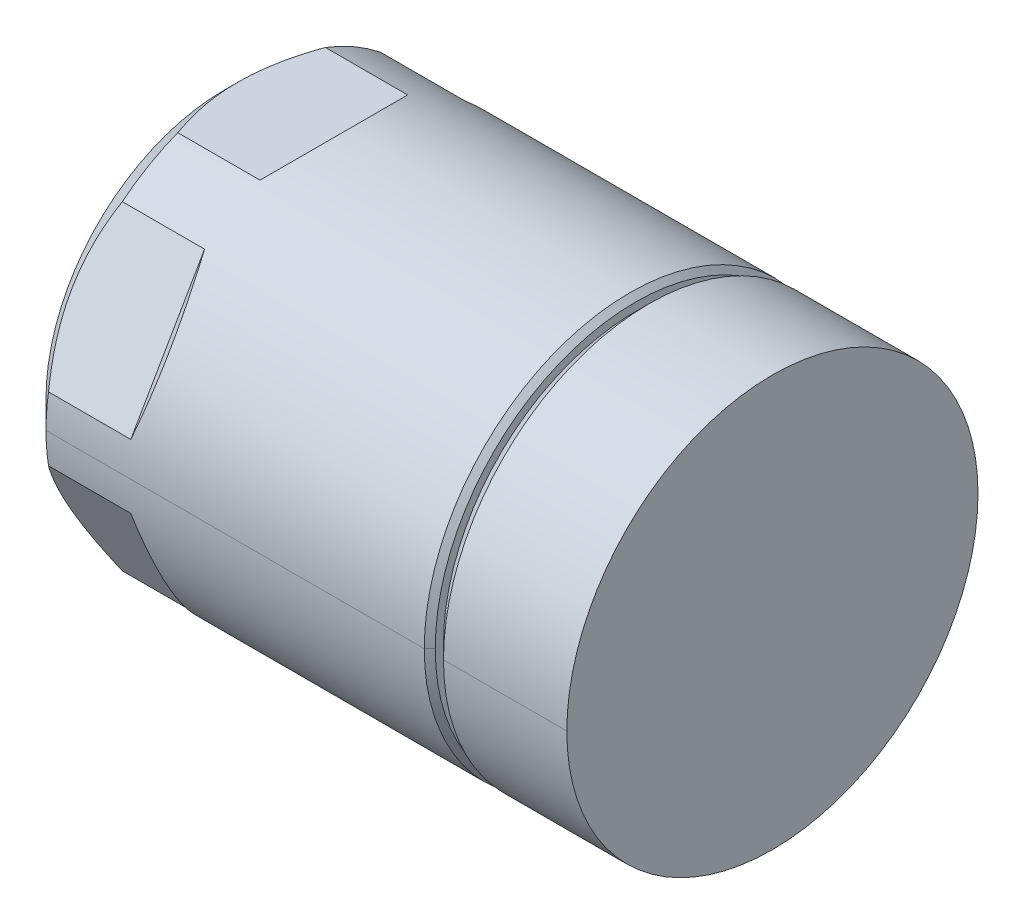
ISO-10303-21;
HEADER;
FILE_DESCRIPTION(('STEP AP214'),'2;1');
FILE_NAME('part.step','',(''),(''),'','','');
FILE_SCHEMA(('AUTOMOTIVE_DESIGN { 1 0 10303 214 1 1 1 1 }'));
ENDSEC;
DATA;
#1=APPLICATION_CONTEXT('core data for automotive mechanical design processes');
#2=APPLICATION_PROTOCOL_DEFINITION('international standard','automotive_design',2000,#1);
#3=PRODUCT_CONTEXT('',#1,'mechanical');
#4=PRODUCT('Part','Part','',(#3));
#5=PRODUCT_RELATED_PRODUCT_CATEGORY('part','',(#4));
#6=PRODUCT_DEFINITION_FORMATION('','',#4);
#7=PRODUCT_DEFINITION_CONTEXT('part definition',#1,'design');
#8=PRODUCT_DEFINITION('design','',#6,#7);
#9=PRODUCT_DEFINITION_SHAPE('','',#8);
#10=(LENGTH_UNIT() NAMED_UNIT(*) SI_UNIT(.MILLI.,.METRE.));
#11=(NAMED_UNIT(*) PLANE_ANGLE_UNIT() SI_UNIT($,.RADIAN.));
#12=(NAMED_UNIT(*) SI_UNIT($,.STERADIAN.) SOLID_ANGLE_UNIT());
#13=UNCERTAINTY_MEASURE_WITH_UNIT(LENGTH_MEASURE(1.E-05),#10,'distance_accuracy_value','');
#14=(GEOMETRIC_REPRESENTATION_CONTEXT(3) GLOBAL_UNCERTAINTY_ASSIGNED_CONTEXT((#13)) GLOBAL_UNIT_ASSIGNED_CONTEXT((#10,
#11,#12)) REPRESENTATION_CONTEXT('',''));
#15=CARTESIAN_POINT('',(0.,0.,0.));
#16=DIRECTION('',(0.,0.,1.));
#17=DIRECTION('',(1.,0.,0.));
#18=AXIS2_PLACEMENT_3D('',#15,#16,#17);
#19=CARTESIAN_POINT('',(-16.6,0.,0.));
#20=DIRECTION('',(1.,0.,0.));
#21=DIRECTION('',(0.,-1.,0.));
#22=AXIS2_PLACEMENT_3D('',#19,#20,#21);
#23=CYLINDRICAL_SURFACE('',#22,7.5);
#24=CARTESIAN_POINT('',(-34.9,0.,0.));
#25=DIRECTION('',(-1.,0.,0.));
#26=DIRECTION('',(0.,0.,1.));
#27=AXIS2_PLACEMENT_3D('',#24,#25,#26);
#28=CIRCLE('',#27,7.5);
#29=CARTESIAN_POINT('',(-34.9,0.,-7.5));
#30=VERTEX_POINT('',#29);
#31=CARTESIAN_POINT('',(-34.9,0.,7.5));
#32=VERTEX_POINT('',#31);
#33=EDGE_CURVE('E46',#30,#32,#28,.F.);
#34=ORIENTED_EDGE('',*,*,#33,.F.);
#35=DIRECTION('',(1.,0.,0.));
#36=VECTOR('',#35,1.);
#37=CARTESIAN_POINT('',(-39.4,0.,-7.5));
#38=LINE('',#37,#36);
#39=CARTESIAN_POINT('',(-39.4,0.,-7.5));
#40=VERTEX_POINT('',#39);
#41=EDGE_CURVE('E53',#40,#30,#38,.T.);
#42=ORIENTED_EDGE('',*,*,#41,.F.);
#43=CARTESIAN_POINT('',(-39.4,0.,0.));
#44=DIRECTION('',(1.,0.,0.));
#45=DIRECTION('',(0.,0.,-1.));
#46=AXIS2_PLACEMENT_3D('',#43,#44,#45);
#47=CIRCLE('',#46,7.5);
#48=CARTESIAN_POINT('',(-39.4,0.,7.5));
#49=VERTEX_POINT('',#48);
#50=EDGE_CURVE('E193',#40,#49,#47,.T.);
#51=ORIENTED_EDGE('',*,*,#50,.T.);
#52=DIRECTION('',(1.,0.,0.));
#53=VECTOR('',#52,1.);
#54=CARTESIAN_POINT('',(-39.4,0.,7.5));
#55=LINE('',#54,#53);
#56=EDGE_CURVE('E41',#49,#32,#55,.T.);
#57=ORIENTED_EDGE('',*,*,#56,.T.);
#58=EDGE_LOOP('',(#34,#42,#51,#57));
#59=FACE_BOUND('',#58,.T.);
#60=ADVANCED_FACE('F34',(#59),#23,.T.);
#61=CARTESIAN_POINT('',(-39.9,0.,0.));
#62=DIRECTION('',(1.,0.,0.));
#63=DIRECTION('',(0.,-1.,0.));
#64=AXIS2_PLACEMENT_3D('',#61,#62,#63);
#65=CONICAL_SURFACE('',#64,7.,0.785398163397448);
#66=DIRECTION('',(0.707106781186549,0.,0.707106781186546));
#67=VECTOR('',#66,1.);
#68=CARTESIAN_POINT('',(-39.9,0.,7.));
#69=LINE('',#68,#67);
#70=CARTESIAN_POINT('',(-39.9,0.,7.));
#71=VERTEX_POINT('',#70);
#72=EDGE_CURVE('E196',#71,#49,#69,.T.);
#73=ORIENTED_EDGE('',*,*,#72,.T.);
#74=ORIENTED_EDGE('',*,*,#50,.F.);
#75=DIRECTION('',(0.707106781186549,0.,-0.707106781186546));
#76=VECTOR('',#75,1.);
#77=CARTESIAN_POINT('',(-39.9,0.,-7.));
#78=LINE('',#77,#76);
#79=CARTESIAN_POINT('',(-39.9,0.,-7.));
#80=VERTEX_POINT('',#79);
#81=EDGE_CURVE('E208',#80,#40,#78,.T.);
#82=ORIENTED_EDGE('',*,*,#81,.F.);
#83=CARTESIAN_POINT('',(-39.9,0.,0.));
#84=DIRECTION('',(1.,0.,0.));
#85=DIRECTION('',(0.,0.,-1.));
#86=AXIS2_PLACEMENT_3D('',#83,#84,#85);
#87=CIRCLE('',#86,7.);
#88=EDGE_CURVE('E212',#80,#71,#87,.T.);
#89=ORIENTED_EDGE('',*,*,#88,.T.);
#90=EDGE_LOOP('',(#73,#74,#82,#89));
#91=FACE_BOUND('',#90,.T.);
#92=ADVANCED_FACE('F562',(#91),#65,.T.);
#93=CARTESIAN_POINT('',(-39.9,7.3,0.));
#94=DIRECTION('',(-1.,0.,0.));
#95=DIRECTION('',(0.,0.,1.));
#96=AXIS2_PLACEMENT_3D('',#93,#94,#95);
#97=PLANE('',#96);
#98=CARTESIAN_POINT('',(-39.9,0.,0.));
#99=DIRECTION('',(1.,0.,0.));
#100=DIRECTION('',(0.,0.,-1.));
#101=AXIS2_PLACEMENT_3D('',#98,#99,#100);
#102=CIRCLE('',#101,7.);
#103=EDGE_CURVE('E216',#71,#80,#102,.T.);
#104=ORIENTED_EDGE('',*,*,#103,.F.);
#105=ORIENTED_EDGE('',*,*,#88,.F.);
#106=EDGE_LOOP('',(#104,#105));
#107=FACE_BOUND('',#106,.T.);
#108=CARTESIAN_POINT('',(-39.9,0.,0.));
#109=DIRECTION('',(1.,0.,0.));
#110=DIRECTION('',(0.,0.,-1.));
#111=AXIS2_PLACEMENT_3D('',#108,#109,#110);
#112=CIRCLE('',#111,7.3);
#113=CARTESIAN_POINT('',(-39.9,0.,-7.3));
#114=VERTEX_POINT('',#113);
#115=CARTESIAN_POINT('',(-39.9,0.,7.30000000000001));
#116=VERTEX_POINT('',#115);
#117=EDGE_CURVE('E221',#114,#116,#112,.T.);
#118=ORIENTED_EDGE('',*,*,#117,.T.);
#119=CARTESIAN_POINT('',(-39.9,0.,0.));
#120=DIRECTION('',(1.,0.,0.));
#121=DIRECTION('',(0.,0.,-1.));
#122=AXIS2_PLACEMENT_3D('',#119,#120,#121);
#123=CIRCLE('',#122,7.3);
#124=EDGE_CURVE('E225',#116,#114,#123,.T.);
#125=ORIENTED_EDGE('',*,*,#124,.T.);
#126=EDGE_LOOP('',(#118,#125));
#127=FACE_BOUND('',#126,.T.);
#128=ADVANCED_FACE('F566',(#107,#127),#97,.F.);
#129=CARTESIAN_POINT('',(-40.1,0.,0.));
#130=DIRECTION('',(-1.,0.,0.));
#131=DIRECTION('',(0.,1.,0.));
#132=AXIS2_PLACEMENT_3D('',#129,#130,#131);
#133=CONICAL_SURFACE('',#132,7.5,0.785398163397434);
#134=DIRECTION('',(-0.707106781186563,0.,-0.707106781186532));
#135=VECTOR('',#134,1.);
#136=CARTESIAN_POINT('',(-39.9,0.,-7.30000000000001));
#137=LINE('',#136,#135);
#138=CARTESIAN_POINT('',(-40.1,0.,-7.5));
#139=VERTEX_POINT('',#138);
#140=EDGE_CURVE('E229',#114,#139,#137,.T.);
#141=ORIENTED_EDGE('',*,*,#140,.F.);
#142=ORIENTED_EDGE('',*,*,#124,.F.);
#143=DIRECTION('',(-0.707106781186563,0.,0.707106781186532));
#144=VECTOR('',#143,1.);
#145=CARTESIAN_POINT('',(-39.9,0.,7.30000000000001));
#146=LINE('',#145,#144);
#147=CARTESIAN_POINT('',(-40.1,0.,7.5));
#148=VERTEX_POINT('',#147);
#149=EDGE_CURVE('E234',#116,#148,#146,.T.);
#150=ORIENTED_EDGE('',*,*,#149,.T.);
#151=CARTESIAN_POINT('',(-40.1,0.,0.));
#152=DIRECTION('',(1.,0.,0.));
#153=DIRECTION('',(0.,0.,-1.));
#154=AXIS2_PLACEMENT_3D('',#151,#152,#153);
#155=CIRCLE('',#154,7.5);
#156=EDGE_CURVE('E238',#148,#139,#155,.T.);
#157=ORIENTED_EDGE('',*,*,#156,.T.);
#158=EDGE_LOOP('',(#141,#142,#150,#157));
#159=FACE_BOUND('',#158,.T.);
#160=ADVANCED_FACE('F571',(#159),#133,.T.);
#161=CARTESIAN_POINT('',(-39.9,0.,0.));
#162=DIRECTION('',(1.,0.,0.));
#163=DIRECTION('',(0.,1.,0.));
#164=AXIS2_PLACEMENT_3D('',#161,#162,#163);
#165=CYLINDRICAL_SURFACE('',#164,7.5);
#166=DIRECTION('',(1.,0.,0.));
#167=VECTOR('',#166,1.);
#168=CARTESIAN_POINT('',(-53.9,0.,7.5));
#169=LINE('',#168,#167);
#170=CARTESIAN_POINT('',(-53.9,0.,7.49999999999999));
#171=VERTEX_POINT('',#170);
#172=EDGE_CURVE('E242',#171,#148,#169,.T.);
#173=ORIENTED_EDGE('',*,*,#172,.F.);
#174=CARTESIAN_POINT('',(-53.9,0.,0.));
#175=DIRECTION('',(1.,0.,0.));
#176=DIRECTION('',(0.,0.,-1.));
#177=AXIS2_PLACEMENT_3D('',#174,#175,#176);
#178=CIRCLE('',#177,7.5);
#179=CARTESIAN_POINT('',(-53.9,-1.16815523672782,7.40846902827469));
#180=VERTEX_POINT('',#179);
#181=EDGE_CURVE('E247',#171,#180,#178,.T.);
#182=ORIENTED_EDGE('',*,*,#181,.T.);
#183=DIRECTION('',(-1.,0.,0.));
#184=VECTOR('',#183,1.);
#185=CARTESIAN_POINT('',(-39.9,-1.16815523672782,7.40846902827469));
#186=LINE('',#185,#184);
#187=CARTESIAN_POINT('',(-50.9,-1.16815523672782,7.40846902827469));
#188=VERTEX_POINT('',#187);
#189=EDGE_CURVE('E251',#188,#180,#186,.T.);
#190=ORIENTED_EDGE('',*,*,#189,.F.);
#191=CARTESIAN_POINT('',(-57.9,0.,0.));
#192=DIRECTION('',(-0.707106781186548,-0.353553390593273,0.612372435695795));
#193=DIRECTION('',(0.707106781186548,-0.353553390593273,0.612372435695795));
#194=AXIS2_PLACEMENT_3D('',#191,#192,#193);
#195=ELLIPSE('',#194,10.6066017177982,7.5);
#196=CARTESIAN_POINT('',(-50.9,-5.83184476327219,4.71588662470747));
#197=VERTEX_POINT('',#196);
#198=EDGE_CURVE('E256',#197,#188,#195,.T.);
#199=ORIENTED_EDGE('',*,*,#198,.F.);
#200=DIRECTION('',(1.,0.,0.));
#201=VECTOR('',#200,1.);
#202=CARTESIAN_POINT('',(-39.9,-5.83184476327219,4.71588662470747));
#203=LINE('',#202,#201);
#204=CARTESIAN_POINT('',(-53.9,-5.83184476327219,4.71588662470747));
#205=VERTEX_POINT('',#204);
#206=EDGE_CURVE('E261',#205,#197,#203,.T.);
#207=ORIENTED_EDGE('',*,*,#206,.F.);
#208=CARTESIAN_POINT('',(-53.9,0.,0.));
#209=DIRECTION('',(1.,0.,0.));
#210=DIRECTION('',(0.,0.,-1.));
#211=AXIS2_PLACEMENT_3D('',#208,#209,#210);
#212=CIRCLE('',#211,7.5);
#213=CARTESIAN_POINT('',(-53.9,-7.,2.69258240356725));
#214=VERTEX_POINT('',#213);
#215=EDGE_CURVE('E266',#205,#214,#212,.T.);
#216=ORIENTED_EDGE('',*,*,#215,.T.);
#217=DIRECTION('',(-1.,0.,0.));
#218=VECTOR('',#217,1.);
#219=CARTESIAN_POINT('',(-39.9,-7.,2.69258240356725));
#220=LINE('',#219,#218);
#221=CARTESIAN_POINT('',(-50.9,-7.,2.69258240356725));
#222=VERTEX_POINT('',#221);
#223=EDGE_CURVE('E270',#222,#214,#220,.T.);
#224=ORIENTED_EDGE('',*,*,#223,.F.);
#225=CARTESIAN_POINT('',(-57.9,0.,0.));
#226=DIRECTION('',(-0.707106781186547,-0.707106781186548,0.));
#227=DIRECTION('',(0.707106781186548,-0.707106781186547,0.));
#228=AXIS2_PLACEMENT_3D('',#225,#226,#227);
#229=ELLIPSE('',#228,10.6066017177982,7.5);
#230=CARTESIAN_POINT('',(-50.9,-7.,-2.69258240356725));
#231=VERTEX_POINT('',#230);
#232=EDGE_CURVE('E275',#231,#222,#229,.T.);
#233=ORIENTED_EDGE('',*,*,#232,.F.);
#234=DIRECTION('',(1.,0.,0.));
#235=VECTOR('',#234,1.);
#236=CARTESIAN_POINT('',(-39.9,-7.,-2.69258240356725));
#237=LINE('',#236,#235);
#238=CARTESIAN_POINT('',(-53.9,-7.,-2.69258240356725));
#239=VERTEX_POINT('',#238);
#240=EDGE_CURVE('E280',#239,#231,#237,.T.);
#241=ORIENTED_EDGE('',*,*,#240,.F.);
#242=CARTESIAN_POINT('',(-53.9,0.,0.));
#243=DIRECTION('',(1.,0.,0.));
#244=DIRECTION('',(0.,0.,-1.));
#245=AXIS2_PLACEMENT_3D('',#242,#243,#244);
#246=CIRCLE('',#245,7.5);
#247=CARTESIAN_POINT('',(-53.9,-5.83184476327218,-4.71588662470747));
#248=VERTEX_POINT('',#247);
#249=EDGE_CURVE('E285',#239,#248,#246,.T.);
#250=ORIENTED_EDGE('',*,*,#249,.T.);
#251=DIRECTION('',(-1.,0.,0.));
#252=VECTOR('',#251,1.);
#253=CARTESIAN_POINT('',(-39.9,-5.83184476327218,-4.71588662470747));
#254=LINE('',#253,#252);
#255=CARTESIAN_POINT('',(-50.9,-5.83184476327218,-4.71588662470747));
#256=VERTEX_POINT('',#255);
#257=EDGE_CURVE('E289',#256,#248,#254,.T.);
#258=ORIENTED_EDGE('',*,*,#257,.F.);
#259=CARTESIAN_POINT('',(-57.9,0.,0.));
#260=DIRECTION('',(-0.707106781186548,-0.353553390593273,-0.612372435695795));
#261=DIRECTION('',(0.707106781186548,-0.353553390593273,-0.612372435695795));
#262=AXIS2_PLACEMENT_3D('',#259,#260,#261);
#263=ELLIPSE('',#262,10.6066017177982,7.5);
#264=CARTESIAN_POINT('',(-50.9,-1.16815523672782,-7.40846902827469));
#265=VERTEX_POINT('',#264);
#266=EDGE_CURVE('E294',#265,#256,#263,.T.);
#267=ORIENTED_EDGE('',*,*,#266,.F.);
#268=DIRECTION('',(1.,0.,0.));
#269=VECTOR('',#268,1.);
#270=CARTESIAN_POINT('',(-39.9,-1.16815523672782,-7.40846902827469));
#271=LINE('',#270,#269);
#272=CARTESIAN_POINT('',(-53.9,-1.16815523672782,-7.40846902827469));
#273=VERTEX_POINT('',#272);
#274=EDGE_CURVE('E299',#273,#265,#271,.T.);
#275=ORIENTED_EDGE('',*,*,#274,.F.);
#276=CARTESIAN_POINT('',(-53.9,0.,0.));
#277=DIRECTION('',(1.,0.,0.));
#278=DIRECTION('',(0.,0.,-1.));
#279=AXIS2_PLACEMENT_3D('',#276,#277,#278);
#280=CIRCLE('',#279,7.5);
#281=CARTESIAN_POINT('',(-53.9,0.,-7.49999999999999));
#282=VERTEX_POINT('',#281);
#283=EDGE_CURVE('E304',#273,#282,#280,.T.);
#284=ORIENTED_EDGE('',*,*,#283,.T.);
#285=DIRECTION('',(1.,0.,0.));
#286=VECTOR('',#285,1.);
#287=CARTESIAN_POINT('',(-53.9,0.,-7.5));
#288=LINE('',#287,#286);
#289=EDGE_CURVE('E308',#282,#139,#288,.T.);
#290=ORIENTED_EDGE('',*,*,#289,.T.);
#291=ORIENTED_EDGE('',*,*,#156,.F.);
#292=EDGE_LOOP('',(#173,#182,#190,#199,#207,#216,#224,#233,#241,#250,#258,#267,#275,#284,#290,#291));
#293=FACE_BOUND('',#292,.T.);
#294=ADVANCED_FACE('F452',(#293),#165,.T.);
#295=CARTESIAN_POINT('',(-39.9,0.,0.));
#296=DIRECTION('',(1.,0.,0.));
#297=DIRECTION('',(0.,-1.,-2.45264421585441E-11));
#298=AXIS2_PLACEMENT_3D('',#295,#296,#297);
#299=CYLINDRICAL_SURFACE('',#298,7.5);
#300=ORIENTED_EDGE('',*,*,#172,.T.);
#301=CARTESIAN_POINT('',(-40.1,0.,0.));
#302=DIRECTION('',(1.,0.,0.));
#303=DIRECTION('',(0.,0.,-1.));
#304=AXIS2_PLACEMENT_3D('',#301,#302,#303);
#305=CIRCLE('',#304,7.5);
#306=EDGE_CURVE('E313',#139,#148,#305,.T.);
#307=ORIENTED_EDGE('',*,*,#306,.F.);
#308=ORIENTED_EDGE('',*,*,#289,.F.);
#309=CARTESIAN_POINT('',(-53.9,0.,0.));
#310=DIRECTION('',(1.,0.,0.));
#311=DIRECTION('',(0.,0.,-1.));
#312=AXIS2_PLACEMENT_3D('',#309,#310,#311);
#313=CIRCLE('',#312,7.5);
#314=CARTESIAN_POINT('',(-53.9,1.16815523672782,-7.40846902827469));
#315=VERTEX_POINT('',#314);
#316=EDGE_CURVE('E318',#282,#315,#313,.T.);
#317=ORIENTED_EDGE('',*,*,#316,.T.);
#318=DIRECTION('',(-1.,0.,0.));
#319=VECTOR('',#318,1.);
#320=CARTESIAN_POINT('',(-39.9,1.16815523672782,-7.40846902827469));
#321=LINE('',#320,#319);
#322=CARTESIAN_POINT('',(-50.9,1.16815523672781,-7.40846902827469));
#323=VERTEX_POINT('',#322);
#324=EDGE_CURVE('E322',#323,#315,#321,.T.);
#325=ORIENTED_EDGE('',*,*,#324,.F.);
#326=CARTESIAN_POINT('',(-57.9,0.,0.));
#327=DIRECTION('',(-0.707106781186548,0.353553390593273,-0.612372435695795));
#328=DIRECTION('',(0.707106781186548,0.353553390593273,-0.612372435695795));
#329=AXIS2_PLACEMENT_3D('',#326,#327,#328);
#330=ELLIPSE('',#329,10.6066017177982,7.5);
#331=CARTESIAN_POINT('',(-50.9,5.83184476327219,-4.71588662470747));
#332=VERTEX_POINT('',#331);
#333=EDGE_CURVE('E327',#332,#323,#330,.T.);
#334=ORIENTED_EDGE('',*,*,#333,.F.);
#335=DIRECTION('',(1.,0.,0.));
#336=VECTOR('',#335,1.);
#337=CARTESIAN_POINT('',(-39.9,5.83184476327218,-4.71588662470747));
#338=LINE('',#337,#336);
#339=CARTESIAN_POINT('',(-53.9,5.83184476327218,-4.71588662470747));
#340=VERTEX_POINT('',#339);
#341=EDGE_CURVE('E332',#340,#332,#338,.T.);
#342=ORIENTED_EDGE('',*,*,#341,.F.);
#343=CARTESIAN_POINT('',(-53.9,0.,0.));
#344=DIRECTION('',(1.,0.,0.));
#345=DIRECTION('',(0.,0.,-1.));
#346=AXIS2_PLACEMENT_3D('',#343,#344,#345);
#347=CIRCLE('',#346,7.5);
#348=CARTESIAN_POINT('',(-53.9,7.,-2.69258240356725));
#349=VERTEX_POINT('',#348);
#350=EDGE_CURVE('E337',#340,#349,#347,.T.);
#351=ORIENTED_EDGE('',*,*,#350,.T.);
#352=DIRECTION('',(-1.,0.,0.));
#353=VECTOR('',#352,1.);
#354=CARTESIAN_POINT('',(-39.9,7.,-2.69258240356725));
#355=LINE('',#354,#353);
#356=CARTESIAN_POINT('',(-50.9,7.,-2.69258240356725));
#357=VERTEX_POINT('',#356);
#358=EDGE_CURVE('E341',#357,#349,#355,.T.);
#359=ORIENTED_EDGE('',*,*,#358,.F.);
#360=CARTESIAN_POINT('',(-57.9,0.,0.));
#361=DIRECTION('',(-0.707106781186547,0.707106781186548,0.));
#362=DIRECTION('',(0.707106781186548,0.707106781186547,0.));
#363=AXIS2_PLACEMENT_3D('',#360,#361,#362);
#364=ELLIPSE('',#363,10.6066017177982,7.5);
#365=CARTESIAN_POINT('',(-50.9,7.,2.69258240356725));
#366=VERTEX_POINT('',#365);
#367=EDGE_CURVE('E346',#366,#357,#364,.T.);
#368=ORIENTED_EDGE('',*,*,#367,.F.);
#369=DIRECTION('',(1.,0.,0.));
#370=VECTOR('',#369,1.);
#371=CARTESIAN_POINT('',(-39.9,7.,2.69258240356725));
#372=LINE('',#371,#370);
#373=CARTESIAN_POINT('',(-53.9,7.,2.69258240356725));
#374=VERTEX_POINT('',#373);
#375=EDGE_CURVE('E351',#374,#366,#372,.T.);
#376=ORIENTED_EDGE('',*,*,#375,.F.);
#377=CARTESIAN_POINT('',(-53.9,0.,0.));
#378=DIRECTION('',(1.,0.,0.));
#379=DIRECTION('',(0.,0.,-1.));
#380=AXIS2_PLACEMENT_3D('',#377,#378,#379);
#381=CIRCLE('',#380,7.5);
#382=CARTESIAN_POINT('',(-53.9,5.83184476327219,4.71588662470747));
#383=VERTEX_POINT('',#382);
#384=EDGE_CURVE('E356',#374,#383,#381,.T.);
#385=ORIENTED_EDGE('',*,*,#384,.T.);
#386=DIRECTION('',(-1.,0.,0.));
#387=VECTOR('',#386,1.);
#388=CARTESIAN_POINT('',(-39.9,5.83184476327219,4.71588662470747));
#389=LINE('',#388,#387);
#390=CARTESIAN_POINT('',(-50.9,5.83184476327218,4.71588662470747));
#391=VERTEX_POINT('',#390);
#392=EDGE_CURVE('E360',#391,#383,#389,.T.);
#393=ORIENTED_EDGE('',*,*,#392,.F.);
#394=CARTESIAN_POINT('',(-57.9,0.,0.));
#395=DIRECTION('',(-0.707106781186548,0.353553390593273,0.612372435695795));
#396=DIRECTION('',(0.707106781186548,0.353553390593273,0.612372435695795));
#397=AXIS2_PLACEMENT_3D('',#394,#395,#396);
#398=ELLIPSE('',#397,10.6066017177982,7.5);
#399=CARTESIAN_POINT('',(-50.9,1.16815523672781,7.40846902827469));
#400=VERTEX_POINT('',#399);
#401=EDGE_CURVE('E365',#400,#391,#398,.T.);
#402=ORIENTED_EDGE('',*,*,#401,.F.);
#403=DIRECTION('',(1.,0.,0.));
#404=VECTOR('',#403,1.);
#405=CARTESIAN_POINT('',(-39.9,1.16815523672782,7.40846902827469));
#406=LINE('',#405,#404);
#407=CARTESIAN_POINT('',(-53.9,1.16815523672781,7.40846902827469));
#408=VERTEX_POINT('',#407);
#409=EDGE_CURVE('E370',#408,#400,#406,.T.);
#410=ORIENTED_EDGE('',*,*,#409,.F.);
#411=CARTESIAN_POINT('',(-53.9,0.,0.));
#412=DIRECTION('',(1.,0.,0.));
#413=DIRECTION('',(0.,0.,-1.));
#414=AXIS2_PLACEMENT_3D('',#411,#412,#413);
#415=CIRCLE('',#414,7.5);
#416=EDGE_CURVE('E375',#408,#171,#415,.T.);
#417=ORIENTED_EDGE('',*,*,#416,.T.);
#418=EDGE_LOOP('',(#300,#307,#308,#317,#325,#334,#342,#351,#359,#368,#376,#385,#393,#402,#410,#417));
#419=FACE_BOUND('',#418,.T.);
#420=ADVANCED_FACE('F409',(#419),#299,.T.);
#421=CARTESIAN_POINT('',(-54.9,0.,0.));
#422=DIRECTION('',(1.,0.,0.));
#423=DIRECTION('',(0.,-1.,0.));
#424=AXIS2_PLACEMENT_3D('',#421,#422,#423);
#425=CONICAL_SURFACE('',#424,6.5,0.785398163397448);
#426=DIRECTION('',(0.707106781186547,0.,0.707106781186548));
#427=VECTOR('',#426,1.);
#428=CARTESIAN_POINT('',(-54.9,0.,6.5));
#429=LINE('',#428,#427);
#430=CARTESIAN_POINT('',(-54.9,0.,6.5));
#431=VERTEX_POINT('',#430);
#432=EDGE_CURVE('E380',#431,#171,#429,.T.);
#433=ORIENTED_EDGE('',*,*,#432,.T.);
#434=ORIENTED_EDGE('',*,*,#416,.F.);
#435=CARTESIAN_POINT('',(-53.8998,5.83232717044583,4.71560810679589));
#436=CARTESIAN_POINT('',(-54.05587938557,5.4558920086622,4.93294304878412));
#437=CARTESIAN_POINT('',(-54.1844553935612,5.06426420413372,5.15904946715077));
#438=CARTESIAN_POINT('',(-54.3566141363815,4.27834622281446,5.61279942522642));
#439=CARTESIAN_POINT('',(-54.4020633454487,3.87189409621757,5.84746466992982));
#440=CARTESIAN_POINT('',(-54.3978357655636,3.08116662564142,6.3039913879226));
#441=CARTESIAN_POINT('',(-54.3503683247814,2.68476782771335,6.53285234061281));
#442=CARTESIAN_POINT('',(-54.1784978341398,1.91753561175901,6.97581406702501));
#443=CARTESIAN_POINT('',(-54.0522896268156,1.53545014448271,7.19641121441042));
#444=CARTESIAN_POINT('',(-53.8998,1.16767282955416,7.40874754618626));
#445=B_SPLINE_CURVE_WITH_KNOTS('',3,(#435,#436,#437,#438,#439,#440,#441,#442,#443,#444),
.UNSPECIFIED.,.F.,.F.,(4,2,2,2,4),(0.,0.252908392134641,0.505816784269282,0.752908392134641,1.),.UNSPECIFIED.);
#446=EDGE_CURVE('E385',#383,#408,#445,.T.);
#447=ORIENTED_EDGE('',*,*,#446,.F.);
#448=ORIENTED_EDGE('',*,*,#384,.F.);
#449=CARTESIAN_POINT('',(-53.9,7.,-2.69258240356725));
#450=CARTESIAN_POINT('',(-54.0768805280114,7.,-2.19989406157719));
#451=CARTESIAN_POINT('',(-54.2183773078662,7.,-1.68383362869768));
#452=CARTESIAN_POINT('',(-54.3726112985933,7.,-0.74615797172385));
#453=CARTESIAN_POINT('',(-54.4060553238297,7.,-0.311963175749915));
#454=CARTESIAN_POINT('',(-54.3920628130809,7.,0.541518702784781));
#455=CARTESIAN_POINT('',(-54.3444751297441,7.,0.974277458905204));
#456=CARTESIAN_POINT('',(-54.1769421015918,7.,1.83255883174275));
#457=CARTESIAN_POINT('',(-54.0512693425971,7.,2.27123222762643));
#458=CARTESIAN_POINT('',(-53.9,7.,2.69258240356725));
#459=B_SPLINE_CURVE_WITH_KNOTS('',3,(#449,#450,#451,#452,#453,#454,#455,#456,#457,#458),
.UNSPECIFIED.,.F.,.F.,(4,2,2,2,4),(0.,0.286875405015952,0.52076887510247,0.754662345188989,1.),.UNSPECIFIED.);
#460=EDGE_CURVE('E442',#349,#374,#459,.T.);
#461=ORIENTED_EDGE('',*,*,#460,.F.);
#462=ORIENTED_EDGE('',*,*,#350,.F.);
#463=CARTESIAN_POINT('',(-53.8998,1.16767282955416,-7.40874754618627));
#464=CARTESIAN_POINT('',(-54.05587938557,1.5441079913378,-7.19141260419804));
#465=CARTESIAN_POINT('',(-54.1844553935612,1.93573579586628,-6.96530618583138));
#466=CARTESIAN_POINT('',(-54.3566141363815,2.72165377718554,-6.51155622775574));
#467=CARTESIAN_POINT('',(-54.4020633454487,3.12810590378242,-6.27689098305233));
#468=CARTESIAN_POINT('',(-54.3978357655636,3.91883337435858,-5.82036426505956));
#469=CARTESIAN_POINT('',(-54.3503683247814,4.31523217228664,-5.59150331236935));
#470=CARTESIAN_POINT('',(-54.1784978341398,5.08246438824099,-5.14854158595715));
#471=CARTESIAN_POINT('',(-54.0522896268156,5.46454985551729,-4.92794443857173));
#472=CARTESIAN_POINT('',(-53.8998,5.83232717044584,-4.7156081067959));
#473=B_SPLINE_CURVE_WITH_KNOTS('',3,(#463,#464,#465,#466,#467,#468,#469,#470,#471,#472),
.UNSPECIFIED.,.F.,.F.,(4,2,2,2,4),(0.,0.252908392134641,0.505816784269282,0.752908392134641,1.),.UNSPECIFIED.);
#474=EDGE_CURVE('E431',#315,#340,#473,.T.);
#475=ORIENTED_EDGE('',*,*,#474,.F.);
#476=ORIENTED_EDGE('',*,*,#316,.F.);
#477=DIRECTION('',(0.707106781186547,0.,-0.707106781186548));
#478=VECTOR('',#477,1.);
#479=CARTESIAN_POINT('',(-54.9,0.,-6.5));
#480=LINE('',#479,#478);
#481=CARTESIAN_POINT('',(-54.9,0.,-6.5));
#482=VERTEX_POINT('',#481);
#483=EDGE_CURVE('E443',#482,#282,#480,.T.);
#484=ORIENTED_EDGE('',*,*,#483,.F.);
#485=CARTESIAN_POINT('',(-54.9,0.,0.));
#486=DIRECTION('',(1.,0.,0.));
#487=DIRECTION('',(0.,0.,-1.));
#488=AXIS2_PLACEMENT_3D('',#485,#486,#487);
#489=CIRCLE('',#488,6.5);
#490=EDGE_CURVE('E464',#482,#431,#489,.T.);
#491=ORIENTED_EDGE('',*,*,#490,.T.);
#492=EDGE_LOOP('',(#433,#434,#447,#448,#461,#462,#475,#476,#484,#491));
#493=FACE_BOUND('',#492,.T.);
#494=ADVANCED_FACE('F398',(#493),#425,.T.);
#495=CARTESIAN_POINT('',(-54.9,5.5,0.));
#496=DIRECTION('',(1.,0.,0.));
#497=DIRECTION('',(0.,0.,-1.));
#498=AXIS2_PLACEMENT_3D('',#495,#496,#497);
#499=PLANE('',#498);
#500=CARTESIAN_POINT('',(-54.9,0.,0.));
#501=DIRECTION('',(1.,0.,0.));
#502=DIRECTION('',(0.,0.,-1.));
#503=AXIS2_PLACEMENT_3D('',#500,#501,#502);
#504=CIRCLE('',#503,6.5);
#505=EDGE_CURVE('E462',#431,#482,#504,.T.);
#506=ORIENTED_EDGE('',*,*,#505,.F.);
#507=ORIENTED_EDGE('',*,*,#490,.F.);
#508=EDGE_LOOP('',(#506,#507));
#509=FACE_BOUND('',#508,.T.);
#510=CARTESIAN_POINT('',(-54.9,-5.23081083962335,-1.69959346906221));
#511=CARTESIAN_POINT('',(-54.9,-4.69636733171791,-3.34217040804436));
#512=CARTESIAN_POINT('',(-54.9,-3.51976643402927,-4.77956892892113));
#513=CARTESIAN_POINT('',(-54.9,-1.79688409020699,-5.65518590309598));
#514=CARTESIAN_POINT('',(-54.9,1.90875666387215,-5.87454896087288));
#515=CARTESIAN_POINT('',(-54.9,4.77774463871152,-3.51895953365164));
#516=CARTESIAN_POINT('',(-54.9,5.65691099009539,-1.79788568784719));
#517=CARTESIAN_POINT('',(-54.9,5.7639194596839,0.0565827987270007));
#518=CARTESIAN_POINT('',(-54.9,5.23081083962335,1.69959346906221));
#519=B_SPLINE_CURVE_WITH_KNOTS('',5,(#510,#511,#512,#513,#514,#515,#516,#517,#518),
.UNSPECIFIED.,.F.,.F.,(6,3,6),(0.,1.5707963267949,3.14159265358979),.UNSPECIFIED.);
#520=CARTESIAN_POINT('',(-54.9,-5.23081083962268,-1.69959346906199));
#521=VERTEX_POINT('',#520);
#522=CARTESIAN_POINT('',(-54.9,5.23081083962268,1.69959346906199));
#523=VERTEX_POINT('',#522);
#524=EDGE_CURVE('E472',#521,#523,#519,.T.);
#525=ORIENTED_EDGE('',*,*,#524,.T.);
#526=CARTESIAN_POINT('',(-54.9,0.,0.));
#527=DIRECTION('',(1.,0.,0.));
#528=DIRECTION('',(0.,0.,-1.));
#529=AXIS2_PLACEMENT_3D('',#526,#527,#528);
#530=CIRCLE('',#529,5.5);
#531=EDGE_CURVE('E487',#523,#521,#530,.T.);
#532=ORIENTED_EDGE('',*,*,#531,.T.);
#533=EDGE_LOOP('',(#525,#532));
#534=FACE_BOUND('',#533,.T.);
#535=ADVANCED_FACE('F408',(#509,#534),#499,.F.);
#536=CARTESIAN_POINT('',(-53.9000000000007,0.,0.));
#537=DIRECTION('',(1.,0.,0.));
#538=DIRECTION('',(0.,0.309016994374947,-0.951056516295154));
#539=AXIS2_PLACEMENT_3D('',#536,#537,#538);
#540=TOROIDAL_SURFACE('',#539,5.4999999999993,0.999999999999301);
#541=CARTESIAN_POINT('',(-53.9000000000007,-5.23081083962268,-1.69959346906199));
#542=DIRECTION('',(0.,0.309016994374947,-0.951056516295154));
#543=DIRECTION('',(-1.,0.,0.));
#544=AXIS2_PLACEMENT_3D('',#541,#542,#543);
#545=CIRCLE('',#544,0.999999999999304);
#546=CARTESIAN_POINT('',(-53.9,-4.27975432332819,-1.39057647468726));
#547=VERTEX_POINT('',#546);
#548=EDGE_CURVE('E489',#521,#547,#545,.T.);
#549=ORIENTED_EDGE('',*,*,#548,.F.);
#550=ORIENTED_EDGE('',*,*,#531,.F.);
#551=CARTESIAN_POINT('',(-53.9000000000007,5.23081083962268,1.69959346906199));
#552=DIRECTION('',(0.,-0.309016994374947,0.951056516295154));
#553=DIRECTION('',(-1.,0.,0.));
#554=AXIS2_PLACEMENT_3D('',#551,#552,#553);
#555=CIRCLE('',#554,0.999999999999304);
#556=CARTESIAN_POINT('',(-53.9,4.27975432332819,1.39057647468726));
#557=VERTEX_POINT('',#556);
#558=EDGE_CURVE('E494',#523,#557,#555,.T.);
#559=ORIENTED_EDGE('',*,*,#558,.T.);
#560=CARTESIAN_POINT('',(-53.9,0.,0.));
#561=DIRECTION('',(1.,0.,0.));
#562=DIRECTION('',(0.,0.,-1.));
#563=AXIS2_PLACEMENT_3D('',#560,#561,#562);
#564=CIRCLE('',#563,4.5);
#565=CARTESIAN_POINT('',(-53.9,0.,4.5));
#566=VERTEX_POINT('',#565);
#567=EDGE_CURVE('E498',#557,#566,#564,.T.);
#568=ORIENTED_EDGE('',*,*,#567,.T.);
#569=CARTESIAN_POINT('',(-53.9,0.,0.));
#570=DIRECTION('',(1.,0.,0.));
#571=DIRECTION('',(0.,0.,-1.));
#572=AXIS2_PLACEMENT_3D('',#569,#570,#571);
#573=CIRCLE('',#572,4.5);
#574=EDGE_CURVE('E502',#566,#547,#573,.T.);
#575=ORIENTED_EDGE('',*,*,#574,.T.);
#576=EDGE_LOOP('',(#549,#550,#559,#568,#575));
#577=FACE_BOUND('',#576,.T.);
#578=ADVANCED_FACE('F552',(#577),#540,.T.);
#579=CARTESIAN_POINT('',(-39.9,0.,0.));
#580=DIRECTION('',(1.,0.,0.));
#581=DIRECTION('',(0.,1.,0.));
#582=AXIS2_PLACEMENT_3D('',#579,#580,#581);
#583=CYLINDRICAL_SURFACE('',#582,4.5);
#584=DIRECTION('',(1.,0.,0.));
#585=VECTOR('',#584,1.);
#586=CARTESIAN_POINT('',(-53.9,0.,4.5));
#587=LINE('',#586,#585);
#588=CARTESIAN_POINT('',(-49.9,0.,4.5));
#589=VERTEX_POINT('',#588);
#590=EDGE_CURVE('E506',#566,#589,#587,.T.);
#591=ORIENTED_EDGE('',*,*,#590,.T.);
#592=CARTESIAN_POINT('',(-49.9,0.,0.));
#593=DIRECTION('',(1.,0.,0.));
#594=DIRECTION('',(0.,0.,-1.));
#595=AXIS2_PLACEMENT_3D('',#592,#593,#594);
#596=CIRCLE('',#595,4.5);
#597=CARTESIAN_POINT('',(-49.9,0.,-4.5));
#598=VERTEX_POINT('',#597);
#599=EDGE_CURVE('E510',#589,#598,#596,.T.);
#600=ORIENTED_EDGE('',*,*,#599,.T.);
#601=DIRECTION('',(1.,0.,0.));
#602=VECTOR('',#601,1.);
#603=CARTESIAN_POINT('',(-53.9,0.,-4.5));
#604=LINE('',#603,#602);
#605=CARTESIAN_POINT('',(-53.9,0.,-4.5));
#606=VERTEX_POINT('',#605);
#607=EDGE_CURVE('E514',#606,#598,#604,.T.);
#608=ORIENTED_EDGE('',*,*,#607,.F.);
#609=CARTESIAN_POINT('',(-53.9,0.,0.));
#610=DIRECTION('',(1.,0.,0.));
#611=DIRECTION('',(0.,0.,-1.));
#612=AXIS2_PLACEMENT_3D('',#609,#610,#611);
#613=CIRCLE('',#612,4.5);
#614=EDGE_CURVE('E519',#547,#606,#613,.T.);
#615=ORIENTED_EDGE('',*,*,#614,.F.);
#616=ORIENTED_EDGE('',*,*,#574,.F.);
#617=EDGE_LOOP('',(#591,#600,#608,#615,#616));
#618=FACE_BOUND('',#617,.T.);
#619=ADVANCED_FACE('F549',(#618),#583,.F.);
#620=CARTESIAN_POINT('',(-53.9000000000007,0.,0.));
#621=DIRECTION('',(1.,0.,0.));
#622=DIRECTION('',(0.,-0.309016994374947,0.951056516295154));
#623=AXIS2_PLACEMENT_3D('',#620,#621,#622);
#624=TOROIDAL_SURFACE('',#623,5.4999999999993,0.999999999999301);
#625=ORIENTED_EDGE('',*,*,#548,.T.);
#626=ORIENTED_EDGE('',*,*,#614,.T.);
#627=CARTESIAN_POINT('',(-53.9,0.,0.));
#628=DIRECTION('',(1.,0.,0.));
#629=DIRECTION('',(0.,0.,-1.));
#630=AXIS2_PLACEMENT_3D('',#627,#628,#629);
#631=CIRCLE('',#630,4.5);
#632=EDGE_CURVE('E524',#606,#557,#631,.T.);
#633=ORIENTED_EDGE('',*,*,#632,.T.);
#634=ORIENTED_EDGE('',*,*,#558,.F.);
#635=ORIENTED_EDGE('',*,*,#524,.F.);
#636=EDGE_LOOP('',(#625,#626,#633,#634,#635));
#637=FACE_BOUND('',#636,.T.);
#638=ADVANCED_FACE('F538',(#637),#624,.T.);
#639=CARTESIAN_POINT('',(-39.9,0.,0.));
#640=DIRECTION('',(1.,0.,0.));
#641=DIRECTION('',(0.,-1.,0.));
#642=AXIS2_PLACEMENT_3D('',#639,#640,#641);
#643=CYLINDRICAL_SURFACE('',#642,4.5);
#644=ORIENTED_EDGE('',*,*,#590,.F.);
#645=ORIENTED_EDGE('',*,*,#567,.F.);
#646=ORIENTED_EDGE('',*,*,#632,.F.);
#647=ORIENTED_EDGE('',*,*,#607,.T.);
#648=CARTESIAN_POINT('',(-49.9,0.,0.));
#649=DIRECTION('',(1.,0.,0.));
#650=DIRECTION('',(0.,0.,-1.));
#651=AXIS2_PLACEMENT_3D('',#648,#649,#650);
#652=CIRCLE('',#651,4.5);
#653=EDGE_CURVE('E529',#598,#589,#652,.T.);
#654=ORIENTED_EDGE('',*,*,#653,.T.);
#655=EDGE_LOOP('',(#644,#645,#646,#647,#654));
#656=FACE_BOUND('',#655,.T.);
#657=ADVANCED_FACE('F548',(#656),#643,.F.);
#658=CARTESIAN_POINT('',(-49.9,0.,0.));
#659=DIRECTION('',(1.,0.,0.));
#660=DIRECTION('',(0.,0.,-1.));
#661=AXIS2_PLACEMENT_3D('',#658,#659,#660);
#662=PLANE('',#661);
#663=ORIENTED_EDGE('',*,*,#599,.F.);
#664=ORIENTED_EDGE('',*,*,#653,.F.);
#665=EDGE_LOOP('',(#663,#664));
#666=FACE_BOUND('',#665,.T.);
#667=ADVANCED_FACE('F713',(#666),#662,.F.);
#668=CARTESIAN_POINT('',(-54.9,0.,0.));
#669=DIRECTION('',(1.,0.,0.));
#670=DIRECTION('',(0.,1.,0.));
#671=AXIS2_PLACEMENT_3D('',#668,#669,#670);
#672=CONICAL_SURFACE('',#671,6.5,0.785398163397448);
#673=ORIENTED_EDGE('',*,*,#432,.F.);
#674=ORIENTED_EDGE('',*,*,#505,.T.);
#675=ORIENTED_EDGE('',*,*,#483,.T.);
#676=ORIENTED_EDGE('',*,*,#283,.F.);
#677=CARTESIAN_POINT('',(-53.8998,-5.83232717044584,-4.7156081067959));
#678=CARTESIAN_POINT('',(-54.05587938557,-5.45589200866221,-4.93294304878412));
#679=CARTESIAN_POINT('',(-54.1844553935612,-5.06426420413373,-5.15904946715078));
#680=CARTESIAN_POINT('',(-54.3566141363815,-4.27834622281447,-5.61279942522642));
#681=CARTESIAN_POINT('',(-54.4020633454487,-3.87189409621758,-5.84746466992983));
#682=CARTESIAN_POINT('',(-54.3978357655636,-3.08116662564143,-6.30399138792261));
#683=CARTESIAN_POINT('',(-54.3503683247814,-2.68476782771336,-6.53285234061282));
#684=CARTESIAN_POINT('',(-54.1784978341398,-1.91753561175901,-6.97581406702501));
#685=CARTESIAN_POINT('',(-54.0522896268156,-1.53545014448271,-7.19641121441043));
#686=CARTESIAN_POINT('',(-53.8998,-1.16767282955417,-7.40874754618626));
#687=B_SPLINE_CURVE_WITH_KNOTS('',3,(#677,#678,#679,#680,#681,#682,#683,#684,#685,#686),
.UNSPECIFIED.,.F.,.F.,(4,2,2,2,4),(0.,0.252908392134641,0.505816784269282,0.752908392134641,1.),.UNSPECIFIED.);
#688=EDGE_CURVE('E930',#248,#273,#687,.T.);
#689=ORIENTED_EDGE('',*,*,#688,.F.);
#690=ORIENTED_EDGE('',*,*,#249,.F.);
#691=CARTESIAN_POINT('',(-53.9,-7.,2.69258240356725));
#692=CARTESIAN_POINT('',(-54.0768805280114,-7.,2.19989406157717));
#693=CARTESIAN_POINT('',(-54.2183773078662,-7.,1.68383362869762));
#694=CARTESIAN_POINT('',(-54.3726112985933,-7.,0.74615797172376));
#695=CARTESIAN_POINT('',(-54.4060553238297,-7.,0.311963175749821));
#696=CARTESIAN_POINT('',(-54.3920628130809,-7.,-0.541518702784882));
#697=CARTESIAN_POINT('',(-54.3444751297441,-7.,-0.97427745890531));
#698=CARTESIAN_POINT('',(-54.1769421015918,-7.,-1.83255883174282));
#699=CARTESIAN_POINT('',(-54.0512693425971,-7.,-2.27123222762646));
#700=CARTESIAN_POINT('',(-53.9,-7.,-2.69258240356725));
#701=B_SPLINE_CURVE_WITH_KNOTS('',3,(#691,#692,#693,#694,#695,#696,#697,#698,#699,#700),
.UNSPECIFIED.,.F.,.F.,(4,2,2,2,4),(0.,0.286875405015967,0.520768875102488,0.754662345189007,1.),.UNSPECIFIED.);
#702=EDGE_CURVE('E921',#214,#239,#701,.T.);
#703=ORIENTED_EDGE('',*,*,#702,.F.);
#704=ORIENTED_EDGE('',*,*,#215,.F.);
#705=CARTESIAN_POINT('',(-53.8998,-1.16767282955411,7.40874754618629));
#706=CARTESIAN_POINT('',(-54.05587938557,-1.54410799133774,7.19141260419807));
#707=CARTESIAN_POINT('',(-54.1844553935612,-1.93573579586623,6.9653061858314));
#708=CARTESIAN_POINT('',(-54.3566141363815,-2.72165377718549,6.51155622775576));
#709=CARTESIAN_POINT('',(-54.4020633454487,-3.12810590378238,6.27689098305235));
#710=CARTESIAN_POINT('',(-54.3978357655636,-3.91883337435856,5.82036426505956));
#711=CARTESIAN_POINT('',(-54.3503683247814,-4.31523217228664,5.59150331236934));
#712=CARTESIAN_POINT('',(-54.1784978341398,-5.08246438824101,5.14854158595713));
#713=CARTESIAN_POINT('',(-54.0522896268156,-5.46454985551732,4.92794443857171));
#714=CARTESIAN_POINT('',(-53.8998,-5.83232717044589,4.71560810679587));
#715=B_SPLINE_CURVE_WITH_KNOTS('',3,(#705,#706,#707,#708,#709,#710,#711,#712,#713,#714),
.UNSPECIFIED.,.F.,.F.,(4,2,2,2,4),(0.,0.252908392134638,0.505816784269276,0.752908392134638,1.),.UNSPECIFIED.);
#716=EDGE_CURVE('E891',#180,#205,#715,.T.);
#717=ORIENTED_EDGE('',*,*,#716,.F.);
#718=ORIENTED_EDGE('',*,*,#181,.F.);
#719=EDGE_LOOP('',(#673,#674,#675,#676,#689,#690,#703,#704,#717,#718));
#720=FACE_BOUND('',#719,.T.);
#721=ADVANCED_FACE('F460',(#720),#672,.T.);
#722=CARTESIAN_POINT('',(-50.9,2.99519052838329,9.81217782649107));
#723=DIRECTION('',(0.,-0.5,0.866025403784439));
#724=DIRECTION('',(0.,-0.866025403784439,-0.5));
#725=AXIS2_PLACEMENT_3D('',#722,#723,#724);
#726=PLANE('',#725);
#727=ORIENTED_EDGE('',*,*,#206,.T.);
#728=DIRECTION('',(0.,-0.866025403784439,-0.5));
#729=VECTOR('',#728,1.);
#730=CARTESIAN_POINT('',(-50.9,2.99519052838329,9.81217782649107));
#731=LINE('',#730,#729);
#732=EDGE_CURVE('E893',#188,#197,#731,.T.);
#733=ORIENTED_EDGE('',*,*,#732,.F.);
#734=ORIENTED_EDGE('',*,*,#189,.T.);
#735=ORIENTED_EDGE('',*,*,#716,.T.);
#736=EDGE_LOOP('',(#727,#733,#734,#735));
#737=FACE_BOUND('',#736,.T.);
#738=ADVANCED_FACE('F712',(#737),#726,.T.);
#739=CARTESIAN_POINT('',(-47.15,1.12019052838328,13.0597730906827));
#740=DIRECTION('',(-0.707106781186548,-0.353553390593273,0.612372435695795));
#741=DIRECTION('',(0.654653670707977,0.,0.755928946018454));
#742=AXIS2_PLACEMENT_3D('',#739,#740,#741);
#743=PLANE('',#742);
#744=ORIENTED_EDGE('',*,*,#198,.T.);
#745=ORIENTED_EDGE('',*,*,#732,.T.);
#746=EDGE_LOOP('',(#744,#745));
#747=FACE_BOUND('',#746,.T.);
#748=ADVANCED_FACE('F794',(#747),#743,.T.);
#749=CARTESIAN_POINT('',(-50.9,-7.,7.5));
#750=DIRECTION('',(0.,-1.,0.));
#751=DIRECTION('',(0.,0.,-1.));
#752=AXIS2_PLACEMENT_3D('',#749,#750,#751);
#753=PLANE('',#752);
#754=ORIENTED_EDGE('',*,*,#240,.T.);
#755=DIRECTION('',(0.,0.,-1.));
#756=VECTOR('',#755,1.);
#757=CARTESIAN_POINT('',(-50.9,-7.,7.5));
#758=LINE('',#757,#756);
#759=EDGE_CURVE('E896',#222,#231,#758,.T.);
#760=ORIENTED_EDGE('',*,*,#759,.F.);
#761=ORIENTED_EDGE('',*,*,#223,.T.);
#762=ORIENTED_EDGE('',*,*,#702,.T.);
#763=EDGE_LOOP('',(#754,#760,#761,#762));
#764=FACE_BOUND('',#763,.T.);
#765=ADVANCED_FACE('F701',(#764),#753,.T.);
#766=CARTESIAN_POINT('',(-47.15,-10.75,7.5));
#767=DIRECTION('',(-0.707106781186547,-0.707106781186548,0.));
#768=DIRECTION('',(0.707106781186548,-0.707106781186547,0.));
#769=AXIS2_PLACEMENT_3D('',#766,#767,#768);
#770=PLANE('',#769);
#771=ORIENTED_EDGE('',*,*,#232,.T.);
#772=ORIENTED_EDGE('',*,*,#759,.T.);
#773=EDGE_LOOP('',(#771,#772));
#774=FACE_BOUND('',#773,.T.);
#775=ADVANCED_FACE('F695',(#774),#770,.T.);
#776=CARTESIAN_POINT('',(-50.9,-9.99519052838328,-2.31217782649109));
#777=DIRECTION('',(0.,-0.5,-0.866025403784439));
#778=DIRECTION('',(0.,0.866025403784439,-0.5));
#779=AXIS2_PLACEMENT_3D('',#776,#777,#778);
#780=PLANE('',#779);
#781=ORIENTED_EDGE('',*,*,#274,.T.);
#782=DIRECTION('',(0.,0.866025403784439,-0.5));
#783=VECTOR('',#782,1.);
#784=CARTESIAN_POINT('',(-50.9,-9.99519052838328,-2.31217782649109));
#785=LINE('',#784,#783);
#786=EDGE_CURVE('E941',#256,#265,#785,.T.);
#787=ORIENTED_EDGE('',*,*,#786,.F.);
#788=ORIENTED_EDGE('',*,*,#257,.T.);
#789=ORIENTED_EDGE('',*,*,#688,.T.);
#790=EDGE_LOOP('',(#781,#787,#788,#789));
#791=FACE_BOUND('',#790,.T.);
#792=ADVANCED_FACE('F700',(#791),#780,.T.);
#793=CARTESIAN_POINT('',(-47.15,-11.8701905283833,-5.55977309068274));
#794=DIRECTION('',(-0.707106781186548,-0.353553390593273,-0.612372435695795));
#795=DIRECTION('',(-0.654653670707977,0.,0.755928946018454));
#796=AXIS2_PLACEMENT_3D('',#793,#794,#795);
#797=PLANE('',#796);
#798=ORIENTED_EDGE('',*,*,#266,.T.);
#799=ORIENTED_EDGE('',*,*,#786,.T.);
#800=EDGE_LOOP('',(#798,#799));
#801=FACE_BOUND('',#800,.T.);
#802=ADVANCED_FACE('F772',(#801),#797,.T.);
#803=CARTESIAN_POINT('',(-54.9,9.99519052838328,-2.31217782649109));
#804=DIRECTION('',(0.,0.5,-0.866025403784439));
#805=DIRECTION('',(0.,0.866025403784439,0.5));
#806=AXIS2_PLACEMENT_3D('',#803,#804,#805);
#807=PLANE('',#806);
#808=ORIENTED_EDGE('',*,*,#341,.T.);
#809=DIRECTION('',(0.,-0.866025403784439,-0.5));
#810=VECTOR('',#809,1.);
#811=CARTESIAN_POINT('',(-50.9,9.99519052838328,-2.31217782649109));
#812=LINE('',#811,#810);
#813=EDGE_CURVE('E447',#332,#323,#812,.T.);
#814=ORIENTED_EDGE('',*,*,#813,.T.);
#815=ORIENTED_EDGE('',*,*,#324,.T.);
#816=ORIENTED_EDGE('',*,*,#474,.T.);
#817=EDGE_LOOP('',(#808,#814,#815,#816));
#818=FACE_BOUND('',#817,.T.);
#819=ADVANCED_FACE('F445',(#818),#807,.T.);
#820=CARTESIAN_POINT('',(-50.9,9.99519052838328,-2.31217782649109));
#821=DIRECTION('',(-0.707106781186548,0.353553390593273,-0.612372435695795));
#822=DIRECTION('',(-0.654653670707977,0.,0.755928946018454));
#823=AXIS2_PLACEMENT_3D('',#820,#821,#822);
#824=PLANE('',#823);
#825=ORIENTED_EDGE('',*,*,#333,.T.);
#826=ORIENTED_EDGE('',*,*,#813,.F.);
#827=EDGE_LOOP('',(#825,#826));
#828=FACE_BOUND('',#827,.T.);
#829=ADVANCED_FACE('F682',(#828),#824,.T.);
#830=CARTESIAN_POINT('',(-54.9,7.,7.5));
#831=DIRECTION('',(0.,1.,0.));
#832=DIRECTION('',(0.,0.,1.));
#833=AXIS2_PLACEMENT_3D('',#830,#831,#832);
#834=PLANE('',#833);
#835=ORIENTED_EDGE('',*,*,#375,.T.);
#836=DIRECTION('',(0.,0.,-1.));
#837=VECTOR('',#836,1.);
#838=CARTESIAN_POINT('',(-50.9,7.,7.5));
#839=LINE('',#838,#837);
#840=EDGE_CURVE('E944',#366,#357,#839,.T.);
#841=ORIENTED_EDGE('',*,*,#840,.T.);
#842=ORIENTED_EDGE('',*,*,#358,.T.);
#843=ORIENTED_EDGE('',*,*,#460,.T.);
#844=EDGE_LOOP('',(#835,#841,#842,#843));
#845=FACE_BOUND('',#844,.T.);
#846=ADVANCED_FACE('F688',(#845),#834,.T.);
#847=CARTESIAN_POINT('',(-50.9,7.,7.5));
#848=DIRECTION('',(-0.707106781186547,0.707106781186548,0.));
#849=DIRECTION('',(-0.707106781186548,-0.707106781186547,0.));
#850=AXIS2_PLACEMENT_3D('',#847,#848,#849);
#851=PLANE('',#850);
#852=ORIENTED_EDGE('',*,*,#367,.T.);
#853=ORIENTED_EDGE('',*,*,#840,.F.);
#854=EDGE_LOOP('',(#852,#853));
#855=FACE_BOUND('',#854,.T.);
#856=ADVANCED_FACE('F749',(#855),#851,.T.);
#857=CARTESIAN_POINT('',(-54.9,-2.99519052838329,9.81217782649107));
#858=DIRECTION('',(0.,0.5,0.866025403784439));
#859=DIRECTION('',(0.,-0.866025403784439,0.5));
#860=AXIS2_PLACEMENT_3D('',#857,#858,#859);
#861=PLANE('',#860);
#862=ORIENTED_EDGE('',*,*,#409,.T.);
#863=DIRECTION('',(0.,0.866025403784439,-0.5));
#864=VECTOR('',#863,1.);
#865=CARTESIAN_POINT('',(-50.9,-2.99519052838329,9.81217782649107));
#866=LINE('',#865,#864);
#867=EDGE_CURVE('E994',#400,#391,#866,.T.);
#868=ORIENTED_EDGE('',*,*,#867,.T.);
#869=ORIENTED_EDGE('',*,*,#392,.T.);
#870=ORIENTED_EDGE('',*,*,#446,.T.);
#871=EDGE_LOOP('',(#862,#868,#869,#870));
#872=FACE_BOUND('',#871,.T.);
#873=ADVANCED_FACE('F668',(#872),#861,.T.);
#874=CARTESIAN_POINT('',(-50.9,-2.99519052838329,9.81217782649107));
#875=DIRECTION('',(-0.707106781186548,0.353553390593273,0.612372435695795));
#876=DIRECTION('',(0.654653670707977,0.,0.755928946018454));
#877=AXIS2_PLACEMENT_3D('',#874,#875,#876);
#878=PLANE('',#877);
#879=ORIENTED_EDGE('',*,*,#401,.T.);
#880=ORIENTED_EDGE('',*,*,#867,.F.);
#881=EDGE_LOOP('',(#879,#880));
#882=FACE_BOUND('',#881,.T.);
#883=ADVANCED_FACE('F647',(#882),#878,.T.);
#884=CARTESIAN_POINT('',(-40.1,0.,0.));
#885=DIRECTION('',(-1.,0.,0.));
#886=DIRECTION('',(0.,-1.,0.));
#887=AXIS2_PLACEMENT_3D('',#884,#885,#886);
#888=CONICAL_SURFACE('',#887,7.5,0.785398163397434);
#889=ORIENTED_EDGE('',*,*,#140,.T.);
#890=ORIENTED_EDGE('',*,*,#306,.T.);
#891=ORIENTED_EDGE('',*,*,#149,.F.);
#892=ORIENTED_EDGE('',*,*,#117,.F.);
#893=EDGE_LOOP('',(#889,#890,#891,#892));
#894=FACE_BOUND('',#893,.T.);
#895=ADVANCED_FACE('F641',(#894),#888,.T.);
#896=CARTESIAN_POINT('',(-39.9,0.,0.));
#897=DIRECTION('',(1.,0.,0.));
#898=DIRECTION('',(0.,1.,0.));
#899=AXIS2_PLACEMENT_3D('',#896,#897,#898);
#900=CONICAL_SURFACE('',#899,7.,0.785398163397448);
#901=ORIENTED_EDGE('',*,*,#72,.F.);
#902=ORIENTED_EDGE('',*,*,#103,.T.);
#903=ORIENTED_EDGE('',*,*,#81,.T.);
#904=CARTESIAN_POINT('',(-39.4,0.,0.));
#905=DIRECTION('',(1.,0.,0.));
#906=DIRECTION('',(0.,0.,-1.));
#907=AXIS2_PLACEMENT_3D('',#904,#905,#906);
#908=CIRCLE('',#907,7.5);
#909=EDGE_CURVE('E188',#49,#40,#908,.T.);
#910=ORIENTED_EDGE('',*,*,#909,.F.);
#911=EDGE_LOOP('',(#901,#902,#903,#910));
#912=FACE_BOUND('',#911,.T.);
#913=ADVANCED_FACE('F646',(#912),#900,.T.);
#914=CARTESIAN_POINT('',(-16.6,0.,0.));
#915=DIRECTION('',(1.,0.,0.));
#916=DIRECTION('',(0.,1.,0.));
#917=AXIS2_PLACEMENT_3D('',#914,#915,#916);
#918=CYLINDRICAL_SURFACE('',#917,7.5);
#919=CARTESIAN_POINT('',(-34.9,0.,0.));
#920=DIRECTION('',(-1.,0.,0.));
#921=DIRECTION('',(0.,0.,1.));
#922=AXIS2_PLACEMENT_3D('',#919,#920,#921);
#923=CIRCLE('',#922,7.5);
#924=EDGE_CURVE('E11',#32,#30,#923,.F.);
#925=ORIENTED_EDGE('',*,*,#924,.F.);
#926=ORIENTED_EDGE('',*,*,#56,.F.);
#927=ORIENTED_EDGE('',*,*,#909,.T.);
#928=ORIENTED_EDGE('',*,*,#41,.T.);
#929=EDGE_LOOP('',(#925,#926,#927,#928));
#930=FACE_BOUND('',#929,.T.);
#931=ADVANCED_FACE('F190',(#930),#918,.T.);
#932=CARTESIAN_POINT('',(-34.9,0.,0.));
#933=DIRECTION('',(-1.,0.,0.));
#934=DIRECTION('',(0.,0.,1.));
#935=AXIS2_PLACEMENT_3D('',#932,#933,#934);
#936=PLANE('',#935);
#937=ORIENTED_EDGE('',*,*,#33,.T.);
#938=ORIENTED_EDGE('',*,*,#924,.T.);
#939=EDGE_LOOP('',(#937,#938));
#940=FACE_BOUND('',#939,.T.);
#941=ADVANCED_FACE('F184',(#940),#936,.F.);
#942=CLOSED_SHELL('',(#60,#92,#128,#160,#294,#420,#494,#535,#578,#619,#638,#657,#667,#721,#738,
#748,#765,#775,#792,#802,#819,#829,#846,#856,#873,#883,#895,#913,#931,#941));
#943=MANIFOLD_SOLID_BREP('B2',#942);
#944=ADVANCED_BREP_SHAPE_REPRESENTATION('',(#18,#943),#14);
#945=SHAPE_DEFINITION_REPRESENTATION(#9,#944);
ENDSEC;
END-ISO-10303-21;
